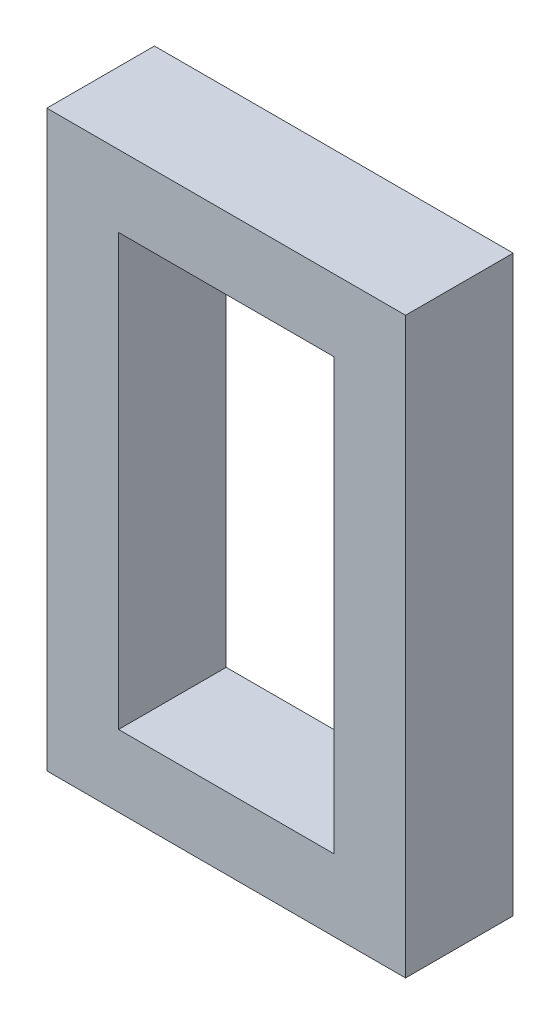
ISO-10303-21;
HEADER;
FILE_DESCRIPTION(('STEP AP214'),'2;1');
FILE_NAME('part.step','',(''),(''),'','','');
FILE_SCHEMA(('AUTOMOTIVE_DESIGN { 1 0 10303 214 1 1 1 1 }'));
ENDSEC;
DATA;
#1=APPLICATION_CONTEXT('core data for automotive mechanical design processes');
#2=APPLICATION_PROTOCOL_DEFINITION('international standard','automotive_design',2000,#1);
#3=PRODUCT_CONTEXT('',#1,'mechanical');
#4=PRODUCT('Part','Part','',(#3));
#5=PRODUCT_RELATED_PRODUCT_CATEGORY('part','',(#4));
#6=PRODUCT_DEFINITION_FORMATION('','',#4);
#7=PRODUCT_DEFINITION_CONTEXT('part definition',#1,'design');
#8=PRODUCT_DEFINITION('design','',#6,#7);
#9=PRODUCT_DEFINITION_SHAPE('','',#8);
#10=(LENGTH_UNIT() NAMED_UNIT(*) SI_UNIT(.MILLI.,.METRE.));
#11=(NAMED_UNIT(*) PLANE_ANGLE_UNIT() SI_UNIT($,.RADIAN.));
#12=(NAMED_UNIT(*) SI_UNIT($,.STERADIAN.) SOLID_ANGLE_UNIT());
#13=UNCERTAINTY_MEASURE_WITH_UNIT(LENGTH_MEASURE(1.E-05),#10,'distance_accuracy_value','');
#14=(GEOMETRIC_REPRESENTATION_CONTEXT(3) GLOBAL_UNCERTAINTY_ASSIGNED_CONTEXT((#13)) GLOBAL_UNIT_ASSIGNED_CONTEXT((#10,
#11,#12)) REPRESENTATION_CONTEXT('',''));
#15=CARTESIAN_POINT('',(0.,0.,0.));
#16=DIRECTION('',(0.,0.,1.));
#17=DIRECTION('',(1.,0.,0.));
#18=AXIS2_PLACEMENT_3D('',#15,#16,#17);
#19=CARTESIAN_POINT('',(0.,0.,3.));
#20=DIRECTION('',(0.,0.,-1.));
#21=DIRECTION('',(-1.,0.,0.));
#22=AXIS2_PLACEMENT_3D('',#19,#20,#21);
#23=PLANE('',#22);
#24=DIRECTION('',(0.,-1.,0.));
#25=VECTOR('',#24,1.);
#26=CARTESIAN_POINT('',(0.,0.,3.));
#27=LINE('',#26,#25);
#28=CARTESIAN_POINT('',(0.,16.,3.));
#29=VERTEX_POINT('',#28);
#30=CARTESIAN_POINT('',(0.,0.,3.));
#31=VERTEX_POINT('',#30);
#32=EDGE_CURVE('E139',#29,#31,#27,.T.);
#33=ORIENTED_EDGE('',*,*,#32,.T.);
#34=DIRECTION('',(1.,0.,0.));
#35=VECTOR('',#34,1.);
#36=CARTESIAN_POINT('',(0.,0.,3.));
#37=LINE('',#36,#35);
#38=CARTESIAN_POINT('',(10.,0.,3.));
#39=VERTEX_POINT('',#38);
#40=EDGE_CURVE('E142',#31,#39,#37,.T.);
#41=ORIENTED_EDGE('',*,*,#40,.T.);
#42=DIRECTION('',(0.,1.,0.));
#43=VECTOR('',#42,1.);
#44=CARTESIAN_POINT('',(10.,0.,3.));
#45=LINE('',#44,#43);
#46=CARTESIAN_POINT('',(10.,16.,3.));
#47=VERTEX_POINT('',#46);
#48=EDGE_CURVE('E147',#39,#47,#45,.T.);
#49=ORIENTED_EDGE('',*,*,#48,.T.);
#50=DIRECTION('',(-1.,0.,0.));
#51=VECTOR('',#50,1.);
#52=CARTESIAN_POINT('',(0.,16.,3.));
#53=LINE('',#52,#51);
#54=EDGE_CURVE('E149',#47,#29,#53,.T.);
#55=ORIENTED_EDGE('',*,*,#54,.T.);
#56=EDGE_LOOP('',(#33,#41,#49,#55));
#57=FACE_BOUND('',#56,.T.);
#58=DIRECTION('',(0.,-1.,0.));
#59=VECTOR('',#58,1.);
#60=CARTESIAN_POINT('',(2.,2.,3.));
#61=LINE('',#60,#59);
#62=CARTESIAN_POINT('',(2.,14.,3.));
#63=VERTEX_POINT('',#62);
#64=CARTESIAN_POINT('',(2.,2.,3.));
#65=VERTEX_POINT('',#64);
#66=EDGE_CURVE('E101',#63,#65,#61,.T.);
#67=ORIENTED_EDGE('',*,*,#66,.F.);
#68=DIRECTION('',(-1.,0.,0.));
#69=VECTOR('',#68,1.);
#70=CARTESIAN_POINT('',(2.,14.,3.));
#71=LINE('',#70,#69);
#72=CARTESIAN_POINT('',(8.,14.,3.));
#73=VERTEX_POINT('',#72);
#74=EDGE_CURVE('E128',#73,#63,#71,.T.);
#75=ORIENTED_EDGE('',*,*,#74,.F.);
#76=DIRECTION('',(0.,1.,0.));
#77=VECTOR('',#76,1.);
#78=CARTESIAN_POINT('',(8.,2.,3.));
#79=LINE('',#78,#77);
#80=CARTESIAN_POINT('',(8.,2.,3.));
#81=VERTEX_POINT('',#80);
#82=EDGE_CURVE('E125',#81,#73,#79,.T.);
#83=ORIENTED_EDGE('',*,*,#82,.F.);
#84=DIRECTION('',(1.,0.,0.));
#85=VECTOR('',#84,1.);
#86=CARTESIAN_POINT('',(2.,2.,3.));
#87=LINE('',#86,#85);
#88=EDGE_CURVE('E115',#65,#81,#87,.T.);
#89=ORIENTED_EDGE('',*,*,#88,.F.);
#90=EDGE_LOOP('',(#67,#75,#83,#89));
#91=FACE_BOUND('',#90,.T.);
#92=ADVANCED_FACE('F39',(#57,#91),#23,.F.);
#93=CARTESIAN_POINT('',(0.,0.,0.));
#94=DIRECTION('',(0.,0.,-1.));
#95=DIRECTION('',(-1.,0.,0.));
#96=AXIS2_PLACEMENT_3D('',#93,#94,#95);
#97=PLANE('',#96);
#98=DIRECTION('',(0.,-1.,0.));
#99=VECTOR('',#98,1.);
#100=CARTESIAN_POINT('',(0.,0.,0.));
#101=LINE('',#100,#99);
#102=CARTESIAN_POINT('',(0.,16.,0.));
#103=VERTEX_POINT('',#102);
#104=CARTESIAN_POINT('',(0.,0.,0.));
#105=VERTEX_POINT('',#104);
#106=EDGE_CURVE('E120',#103,#105,#101,.T.);
#107=ORIENTED_EDGE('',*,*,#106,.F.);
#108=DIRECTION('',(-1.,0.,0.));
#109=VECTOR('',#108,1.);
#110=CARTESIAN_POINT('',(0.,16.,0.));
#111=LINE('',#110,#109);
#112=CARTESIAN_POINT('',(10.,16.,0.));
#113=VERTEX_POINT('',#112);
#114=EDGE_CURVE('E143',#113,#103,#111,.T.);
#115=ORIENTED_EDGE('',*,*,#114,.F.);
#116=DIRECTION('',(0.,1.,0.));
#117=VECTOR('',#116,1.);
#118=CARTESIAN_POINT('',(10.,0.,0.));
#119=LINE('',#118,#117);
#120=CARTESIAN_POINT('',(10.,0.,0.));
#121=VERTEX_POINT('',#120);
#122=EDGE_CURVE('E155',#121,#113,#119,.T.);
#123=ORIENTED_EDGE('',*,*,#122,.F.);
#124=DIRECTION('',(1.,0.,0.));
#125=VECTOR('',#124,1.);
#126=CARTESIAN_POINT('',(0.,0.,0.));
#127=LINE('',#126,#125);
#128=EDGE_CURVE('E154',#105,#121,#127,.T.);
#129=ORIENTED_EDGE('',*,*,#128,.F.);
#130=EDGE_LOOP('',(#107,#115,#123,#129));
#131=FACE_BOUND('',#130,.T.);
#132=DIRECTION('',(-1.,0.,0.));
#133=VECTOR('',#132,1.);
#134=CARTESIAN_POINT('',(2.,14.,0.));
#135=LINE('',#134,#133);
#136=CARTESIAN_POINT('',(8.,14.,0.));
#137=VERTEX_POINT('',#136);
#138=CARTESIAN_POINT('',(2.,14.,0.));
#139=VERTEX_POINT('',#138);
#140=EDGE_CURVE('E111',#137,#139,#135,.T.);
#141=ORIENTED_EDGE('',*,*,#140,.T.);
#142=DIRECTION('',(0.,-1.,0.));
#143=VECTOR('',#142,1.);
#144=CARTESIAN_POINT('',(2.,2.,0.));
#145=LINE('',#144,#143);
#146=CARTESIAN_POINT('',(2.,2.,0.));
#147=VERTEX_POINT('',#146);
#148=EDGE_CURVE('E62',#139,#147,#145,.T.);
#149=ORIENTED_EDGE('',*,*,#148,.T.);
#150=DIRECTION('',(1.,0.,0.));
#151=VECTOR('',#150,1.);
#152=CARTESIAN_POINT('',(2.,2.,0.));
#153=LINE('',#152,#151);
#154=CARTESIAN_POINT('',(8.,2.,0.));
#155=VERTEX_POINT('',#154);
#156=EDGE_CURVE('E118',#147,#155,#153,.T.);
#157=ORIENTED_EDGE('',*,*,#156,.T.);
#158=DIRECTION('',(0.,1.,0.));
#159=VECTOR('',#158,1.);
#160=CARTESIAN_POINT('',(8.,2.,0.));
#161=LINE('',#160,#159);
#162=EDGE_CURVE('E135',#155,#137,#161,.T.);
#163=ORIENTED_EDGE('',*,*,#162,.T.);
#164=EDGE_LOOP('',(#141,#149,#157,#163));
#165=FACE_BOUND('',#164,.T.);
#166=ADVANCED_FACE('F171',(#131,#165),#97,.T.);
#167=CARTESIAN_POINT('',(0.,0.,3.));
#168=DIRECTION('',(1.,0.,0.));
#169=DIRECTION('',(0.,0.,-1.));
#170=AXIS2_PLACEMENT_3D('',#167,#168,#169);
#171=PLANE('',#170);
#172=ORIENTED_EDGE('',*,*,#106,.T.);
#173=DIRECTION('',(0.,0.,-1.));
#174=VECTOR('',#173,1.);
#175=CARTESIAN_POINT('',(0.,0.,3.));
#176=LINE('',#175,#174);
#177=EDGE_CURVE('E11',#31,#105,#176,.T.);
#178=ORIENTED_EDGE('',*,*,#177,.F.);
#179=ORIENTED_EDGE('',*,*,#32,.F.);
#180=DIRECTION('',(0.,0.,-1.));
#181=VECTOR('',#180,1.);
#182=CARTESIAN_POINT('',(0.,16.,3.));
#183=LINE('',#182,#181);
#184=EDGE_CURVE('E148',#29,#103,#183,.T.);
#185=ORIENTED_EDGE('',*,*,#184,.T.);
#186=EDGE_LOOP('',(#172,#178,#179,#185));
#187=FACE_BOUND('',#186,.T.);
#188=ADVANCED_FACE('F41',(#187),#171,.F.);
#189=CARTESIAN_POINT('',(0.,0.,3.));
#190=DIRECTION('',(0.,1.,0.));
#191=DIRECTION('',(0.,0.,1.));
#192=AXIS2_PLACEMENT_3D('',#189,#190,#191);
#193=PLANE('',#192);
#194=ORIENTED_EDGE('',*,*,#128,.T.);
#195=DIRECTION('',(0.,0.,-1.));
#196=VECTOR('',#195,1.);
#197=CARTESIAN_POINT('',(10.,0.,3.));
#198=LINE('',#197,#196);
#199=EDGE_CURVE('E50',#39,#121,#198,.T.);
#200=ORIENTED_EDGE('',*,*,#199,.F.);
#201=ORIENTED_EDGE('',*,*,#40,.F.);
#202=ORIENTED_EDGE('',*,*,#177,.T.);
#203=EDGE_LOOP('',(#194,#200,#201,#202));
#204=FACE_BOUND('',#203,.T.);
#205=ADVANCED_FACE('F183',(#204),#193,.F.);
#206=CARTESIAN_POINT('',(10.,0.,3.));
#207=DIRECTION('',(-1.,0.,0.));
#208=DIRECTION('',(0.,0.,1.));
#209=AXIS2_PLACEMENT_3D('',#206,#207,#208);
#210=PLANE('',#209);
#211=ORIENTED_EDGE('',*,*,#122,.T.);
#212=DIRECTION('',(0.,0.,-1.));
#213=VECTOR('',#212,1.);
#214=CARTESIAN_POINT('',(10.,16.,3.));
#215=LINE('',#214,#213);
#216=EDGE_CURVE('E158',#47,#113,#215,.T.);
#217=ORIENTED_EDGE('',*,*,#216,.F.);
#218=ORIENTED_EDGE('',*,*,#48,.F.);
#219=ORIENTED_EDGE('',*,*,#199,.T.);
#220=EDGE_LOOP('',(#211,#217,#218,#219));
#221=FACE_BOUND('',#220,.T.);
#222=ADVANCED_FACE('F167',(#221),#210,.F.);
#223=CARTESIAN_POINT('',(0.,16.,3.));
#224=DIRECTION('',(0.,-1.,0.));
#225=DIRECTION('',(0.,0.,-1.));
#226=AXIS2_PLACEMENT_3D('',#223,#224,#225);
#227=PLANE('',#226);
#228=ORIENTED_EDGE('',*,*,#114,.T.);
#229=ORIENTED_EDGE('',*,*,#184,.F.);
#230=ORIENTED_EDGE('',*,*,#54,.F.);
#231=ORIENTED_EDGE('',*,*,#216,.T.);
#232=EDGE_LOOP('',(#228,#229,#230,#231));
#233=FACE_BOUND('',#232,.T.);
#234=ADVANCED_FACE('F180',(#233),#227,.F.);
#235=CARTESIAN_POINT('',(2.,2.,3.));
#236=DIRECTION('',(1.,0.,0.));
#237=DIRECTION('',(0.,0.,-1.));
#238=AXIS2_PLACEMENT_3D('',#235,#236,#237);
#239=PLANE('',#238);
#240=ORIENTED_EDGE('',*,*,#148,.F.);
#241=DIRECTION('',(0.,0.,-1.));
#242=VECTOR('',#241,1.);
#243=CARTESIAN_POINT('',(2.,14.,3.));
#244=LINE('',#243,#242);
#245=EDGE_CURVE('E109',#63,#139,#244,.T.);
#246=ORIENTED_EDGE('',*,*,#245,.F.);
#247=ORIENTED_EDGE('',*,*,#66,.T.);
#248=DIRECTION('',(0.,0.,-1.));
#249=VECTOR('',#248,1.);
#250=CARTESIAN_POINT('',(2.,2.,3.));
#251=LINE('',#250,#249);
#252=EDGE_CURVE('E107',#65,#147,#251,.T.);
#253=ORIENTED_EDGE('',*,*,#252,.T.);
#254=EDGE_LOOP('',(#240,#246,#247,#253));
#255=FACE_BOUND('',#254,.T.);
#256=ADVANCED_FACE('F106',(#255),#239,.T.);
#257=CARTESIAN_POINT('',(2.,2.,3.));
#258=DIRECTION('',(0.,1.,0.));
#259=DIRECTION('',(0.,0.,1.));
#260=AXIS2_PLACEMENT_3D('',#257,#258,#259);
#261=PLANE('',#260);
#262=ORIENTED_EDGE('',*,*,#156,.F.);
#263=ORIENTED_EDGE('',*,*,#252,.F.);
#264=ORIENTED_EDGE('',*,*,#88,.T.);
#265=DIRECTION('',(0.,0.,-1.));
#266=VECTOR('',#265,1.);
#267=CARTESIAN_POINT('',(8.,2.,3.));
#268=LINE('',#267,#266);
#269=EDGE_CURVE('E123',#81,#155,#268,.T.);
#270=ORIENTED_EDGE('',*,*,#269,.T.);
#271=EDGE_LOOP('',(#262,#263,#264,#270));
#272=FACE_BOUND('',#271,.T.);
#273=ADVANCED_FACE('F116',(#272),#261,.T.);
#274=CARTESIAN_POINT('',(8.,2.,3.));
#275=DIRECTION('',(-1.,0.,0.));
#276=DIRECTION('',(0.,0.,1.));
#277=AXIS2_PLACEMENT_3D('',#274,#275,#276);
#278=PLANE('',#277);
#279=ORIENTED_EDGE('',*,*,#162,.F.);
#280=ORIENTED_EDGE('',*,*,#269,.F.);
#281=ORIENTED_EDGE('',*,*,#82,.T.);
#282=DIRECTION('',(0.,0.,-1.));
#283=VECTOR('',#282,1.);
#284=CARTESIAN_POINT('',(8.,14.,3.));
#285=LINE('',#284,#283);
#286=EDGE_CURVE('E53',#73,#137,#285,.T.);
#287=ORIENTED_EDGE('',*,*,#286,.T.);
#288=EDGE_LOOP('',(#279,#280,#281,#287));
#289=FACE_BOUND('',#288,.T.);
#290=ADVANCED_FACE('F206',(#289),#278,.T.);
#291=CARTESIAN_POINT('',(2.,14.,3.));
#292=DIRECTION('',(0.,-1.,0.));
#293=DIRECTION('',(0.,0.,-1.));
#294=AXIS2_PLACEMENT_3D('',#291,#292,#293);
#295=PLANE('',#294);
#296=ORIENTED_EDGE('',*,*,#140,.F.);
#297=ORIENTED_EDGE('',*,*,#286,.F.);
#298=ORIENTED_EDGE('',*,*,#74,.T.);
#299=ORIENTED_EDGE('',*,*,#245,.T.);
#300=EDGE_LOOP('',(#296,#297,#298,#299));
#301=FACE_BOUND('',#300,.T.);
#302=ADVANCED_FACE('F210',(#301),#295,.T.);
#303=CLOSED_SHELL('',(#92,#166,#188,#205,#222,#234,#256,#273,#290,#302));
#304=MANIFOLD_SOLID_BREP('B2',#303);
#305=ADVANCED_BREP_SHAPE_REPRESENTATION('',(#18,#304),#14);
#306=SHAPE_DEFINITION_REPRESENTATION(#9,#305);
ENDSEC;
END-ISO-10303-21;
